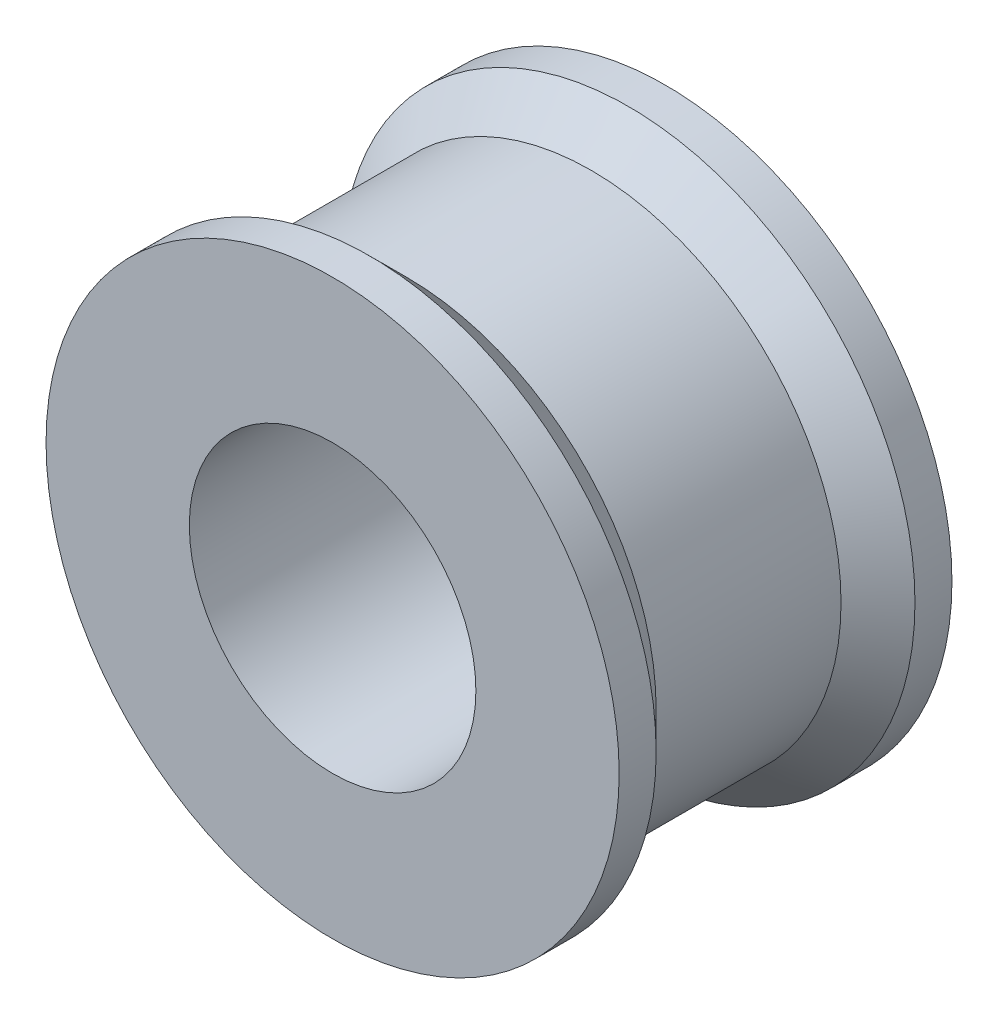
ISO-10303-21;
HEADER;
FILE_DESCRIPTION(('STEP AP214'),'2;1');
FILE_NAME('part.step','',(''),(''),'','','');
FILE_SCHEMA(('AUTOMOTIVE_DESIGN { 1 0 10303 214 1 1 1 1 }'));
ENDSEC;
DATA;
#1=APPLICATION_CONTEXT('core data for automotive mechanical design processes');
#2=APPLICATION_PROTOCOL_DEFINITION('international standard','automotive_design',2000,#1);
#3=PRODUCT_CONTEXT('',#1,'mechanical');
#4=PRODUCT('Part','Part','',(#3));
#5=PRODUCT_RELATED_PRODUCT_CATEGORY('part','',(#4));
#6=PRODUCT_DEFINITION_FORMATION('','',#4);
#7=PRODUCT_DEFINITION_CONTEXT('part definition',#1,'design');
#8=PRODUCT_DEFINITION('design','',#6,#7);
#9=PRODUCT_DEFINITION_SHAPE('','',#8);
#10=(LENGTH_UNIT() NAMED_UNIT(*) SI_UNIT(.MILLI.,.METRE.));
#11=(NAMED_UNIT(*) PLANE_ANGLE_UNIT() SI_UNIT($,.RADIAN.));
#12=(NAMED_UNIT(*) SI_UNIT($,.STERADIAN.) SOLID_ANGLE_UNIT());
#13=UNCERTAINTY_MEASURE_WITH_UNIT(LENGTH_MEASURE(1.E-05),#10,'distance_accuracy_value','');
#14=(GEOMETRIC_REPRESENTATION_CONTEXT(3) GLOBAL_UNCERTAINTY_ASSIGNED_CONTEXT((#13)) GLOBAL_UNIT_ASSIGNED_CONTEXT((#10,
#11,#12)) REPRESENTATION_CONTEXT('',''));
#15=CARTESIAN_POINT('',(0.,0.,0.));
#16=DIRECTION('',(0.,0.,1.));
#17=DIRECTION('',(1.,0.,0.));
#18=AXIS2_PLACEMENT_3D('',#15,#16,#17);
#19=CARTESIAN_POINT('',(0.,0.,0.));
#20=DIRECTION('',(0.,0.,1.));
#21=DIRECTION('',(1.,0.,0.));
#22=AXIS2_PLACEMENT_3D('',#19,#20,#21);
#23=PLANE('',#22);
#24=CARTESIAN_POINT('',(0.,0.,0.));
#25=DIRECTION('',(0.,0.,1.));
#26=DIRECTION('',(1.,0.,0.));
#27=AXIS2_PLACEMENT_3D('',#24,#25,#26);
#28=CIRCLE('',#27,7.75);
#29=CARTESIAN_POINT('',(7.75,0.,0.));
#30=VERTEX_POINT('',#29);
#31=EDGE_CURVE('E42',#30,#30,#28,.T.);
#32=ORIENTED_EDGE('',*,*,#31,.F.);
#33=EDGE_LOOP('',(#32));
#34=FACE_BOUND('',#33,.T.);
#35=CARTESIAN_POINT('',(0.,0.,0.));
#36=DIRECTION('',(0.,0.,1.));
#37=DIRECTION('',(1.,0.,0.));
#38=AXIS2_PLACEMENT_3D('',#35,#36,#37);
#39=CIRCLE('',#38,3.875);
#40=CARTESIAN_POINT('',(3.875,0.,0.));
#41=VERTEX_POINT('',#40);
#42=EDGE_CURVE('E47',#41,#41,#39,.T.);
#43=ORIENTED_EDGE('',*,*,#42,.T.);
#44=EDGE_LOOP('',(#43));
#45=FACE_BOUND('',#44,.T.);
#46=ADVANCED_FACE('F31',(#34,#45),#23,.F.);
#47=CARTESIAN_POINT('',(0.,0.,1.));
#48=DIRECTION('',(0.,0.,-1.));
#49=DIRECTION('',(-1.,0.,0.));
#50=AXIS2_PLACEMENT_3D('',#47,#48,#49);
#51=CYLINDRICAL_SURFACE('',#50,7.75);
#52=CARTESIAN_POINT('',(0.,0.,1.));
#53=DIRECTION('',(0.,0.,1.));
#54=DIRECTION('',(1.,0.,0.));
#55=AXIS2_PLACEMENT_3D('',#52,#53,#54);
#56=CIRCLE('',#55,7.75);
#57=CARTESIAN_POINT('',(7.75,0.,1.));
#58=VERTEX_POINT('',#57);
#59=EDGE_CURVE('E38',#58,#58,#56,.T.);
#60=ORIENTED_EDGE('',*,*,#59,.F.);
#61=EDGE_LOOP('',(#60));
#62=FACE_BOUND('',#61,.T.);
#63=ORIENTED_EDGE('',*,*,#31,.T.);
#64=EDGE_LOOP('',(#63));
#65=FACE_BOUND('',#64,.T.);
#66=ADVANCED_FACE('F80',(#62,#65),#51,.T.);
#67=CARTESIAN_POINT('',(0.,0.,1.));
#68=DIRECTION('',(0.,0.,-1.));
#69=DIRECTION('',(-1.,0.,0.));
#70=AXIS2_PLACEMENT_3D('',#67,#68,#69);
#71=CYLINDRICAL_SURFACE('',#70,3.875);
#72=ORIENTED_EDGE('',*,*,#42,.F.);
#73=EDGE_LOOP('',(#72));
#74=FACE_BOUND('',#73,.T.);
#75=CARTESIAN_POINT('',(0.,0.,9.));
#76=DIRECTION('',(0.,0.,1.));
#77=DIRECTION('',(1.,0.,0.));
#78=AXIS2_PLACEMENT_3D('',#75,#76,#77);
#79=CIRCLE('',#78,3.875);
#80=CARTESIAN_POINT('',(3.875,0.,9.));
#81=VERTEX_POINT('',#80);
#82=EDGE_CURVE('E58',#81,#81,#79,.T.);
#83=ORIENTED_EDGE('',*,*,#82,.T.);
#84=EDGE_LOOP('',(#83));
#85=FACE_BOUND('',#84,.T.);
#86=ADVANCED_FACE('F64',(#74,#85),#71,.F.);
#87=CARTESIAN_POINT('',(0.,0.,4.5));
#88=DIRECTION('',(0.,0.,-1.));
#89=DIRECTION('',(-1.,0.,0.));
#90=AXIS2_PLACEMENT_3D('',#87,#88,#89);
#91=CYLINDRICAL_SURFACE('',#90,6.75);
#92=CARTESIAN_POINT('',(0.,0.,2.00000000000001));
#93=DIRECTION('',(0.,0.,1.));
#94=DIRECTION('',(1.,0.,0.));
#95=AXIS2_PLACEMENT_3D('',#92,#93,#94);
#96=CIRCLE('',#95,6.75);
#97=CARTESIAN_POINT('',(6.75,0.,2.00000000000001));
#98=VERTEX_POINT('',#97);
#99=EDGE_CURVE('E10',#98,#98,#96,.T.);
#100=ORIENTED_EDGE('',*,*,#99,.T.);
#101=EDGE_LOOP('',(#100));
#102=FACE_BOUND('',#101,.T.);
#103=CARTESIAN_POINT('',(0.,0.,6.99999999999999));
#104=DIRECTION('',(0.,0.,1.));
#105=DIRECTION('',(1.,0.,0.));
#106=AXIS2_PLACEMENT_3D('',#103,#104,#105);
#107=CIRCLE('',#106,6.75);
#108=CARTESIAN_POINT('',(6.75,0.,6.99999999999999));
#109=VERTEX_POINT('',#108);
#110=EDGE_CURVE('E51',#109,#109,#107,.T.);
#111=ORIENTED_EDGE('',*,*,#110,.F.);
#112=EDGE_LOOP('',(#111));
#113=FACE_BOUND('',#112,.T.);
#114=ADVANCED_FACE('F78',(#102,#113),#91,.T.);
#115=CARTESIAN_POINT('',(0.,0.,2.00000000000001));
#116=DIRECTION('',(0.,0.,-1.));
#117=DIRECTION('',(-1.,0.,0.));
#118=AXIS2_PLACEMENT_3D('',#115,#116,#117);
#119=CONICAL_SURFACE('',#118,6.75,0.785398163397443);
#120=ORIENTED_EDGE('',*,*,#59,.T.);
#121=EDGE_LOOP('',(#120));
#122=FACE_BOUND('',#121,.T.);
#123=ORIENTED_EDGE('',*,*,#99,.F.);
#124=EDGE_LOOP('',(#123));
#125=FACE_BOUND('',#124,.T.);
#126=ADVANCED_FACE('F33',(#122,#125),#119,.T.);
#127=CARTESIAN_POINT('',(0.,0.,9.));
#128=DIRECTION('',(0.,0.,-1.));
#129=DIRECTION('',(1.,0.,0.));
#130=AXIS2_PLACEMENT_3D('',#127,#128,#129);
#131=PLANE('',#130);
#132=CARTESIAN_POINT('',(0.,0.,9.));
#133=DIRECTION('',(0.,0.,1.));
#134=DIRECTION('',(1.,0.,0.));
#135=AXIS2_PLACEMENT_3D('',#132,#133,#134);
#136=CIRCLE('',#135,7.75);
#137=CARTESIAN_POINT('',(7.75,0.,9.));
#138=VERTEX_POINT('',#137);
#139=EDGE_CURVE('E55',#138,#138,#136,.T.);
#140=ORIENTED_EDGE('',*,*,#139,.T.);
#141=EDGE_LOOP('',(#140));
#142=FACE_BOUND('',#141,.T.);
#143=ORIENTED_EDGE('',*,*,#82,.F.);
#144=EDGE_LOOP('',(#143));
#145=FACE_BOUND('',#144,.T.);
#146=ADVANCED_FACE('F66',(#142,#145),#131,.F.);
#147=CARTESIAN_POINT('',(0.,0.,8.));
#148=DIRECTION('',(0.,0.,1.));
#149=DIRECTION('',(-1.,0.,0.));
#150=AXIS2_PLACEMENT_3D('',#147,#148,#149);
#151=CYLINDRICAL_SURFACE('',#150,7.75);
#152=CARTESIAN_POINT('',(0.,0.,8.));
#153=DIRECTION('',(0.,0.,1.));
#154=DIRECTION('',(1.,0.,0.));
#155=AXIS2_PLACEMENT_3D('',#152,#153,#154);
#156=CIRCLE('',#155,7.75);
#157=CARTESIAN_POINT('',(7.75,0.,8.));
#158=VERTEX_POINT('',#157);
#159=EDGE_CURVE('E54',#158,#158,#156,.T.);
#160=ORIENTED_EDGE('',*,*,#159,.T.);
#161=EDGE_LOOP('',(#160));
#162=FACE_BOUND('',#161,.T.);
#163=ORIENTED_EDGE('',*,*,#139,.F.);
#164=EDGE_LOOP('',(#163));
#165=FACE_BOUND('',#164,.T.);
#166=ADVANCED_FACE('F68',(#162,#165),#151,.T.);
#167=CARTESIAN_POINT('',(0.,0.,6.99999999999999));
#168=DIRECTION('',(0.,0.,1.));
#169=DIRECTION('',(-1.,0.,0.));
#170=AXIS2_PLACEMENT_3D('',#167,#168,#169);
#171=CONICAL_SURFACE('',#170,6.75,0.785398163397443);
#172=ORIENTED_EDGE('',*,*,#159,.F.);
#173=EDGE_LOOP('',(#172));
#174=FACE_BOUND('',#173,.T.);
#175=ORIENTED_EDGE('',*,*,#110,.T.);
#176=EDGE_LOOP('',(#175));
#177=FACE_BOUND('',#176,.T.);
#178=ADVANCED_FACE('F75',(#174,#177),#171,.T.);
#179=CLOSED_SHELL('',(#46,#66,#86,#114,#126,#146,#166,#178));
#180=MANIFOLD_SOLID_BREP('B2',#179);
#181=ADVANCED_BREP_SHAPE_REPRESENTATION('',(#18,#180),#14);
#182=SHAPE_DEFINITION_REPRESENTATION(#9,#181);
ENDSEC;
END-ISO-10303-21;
